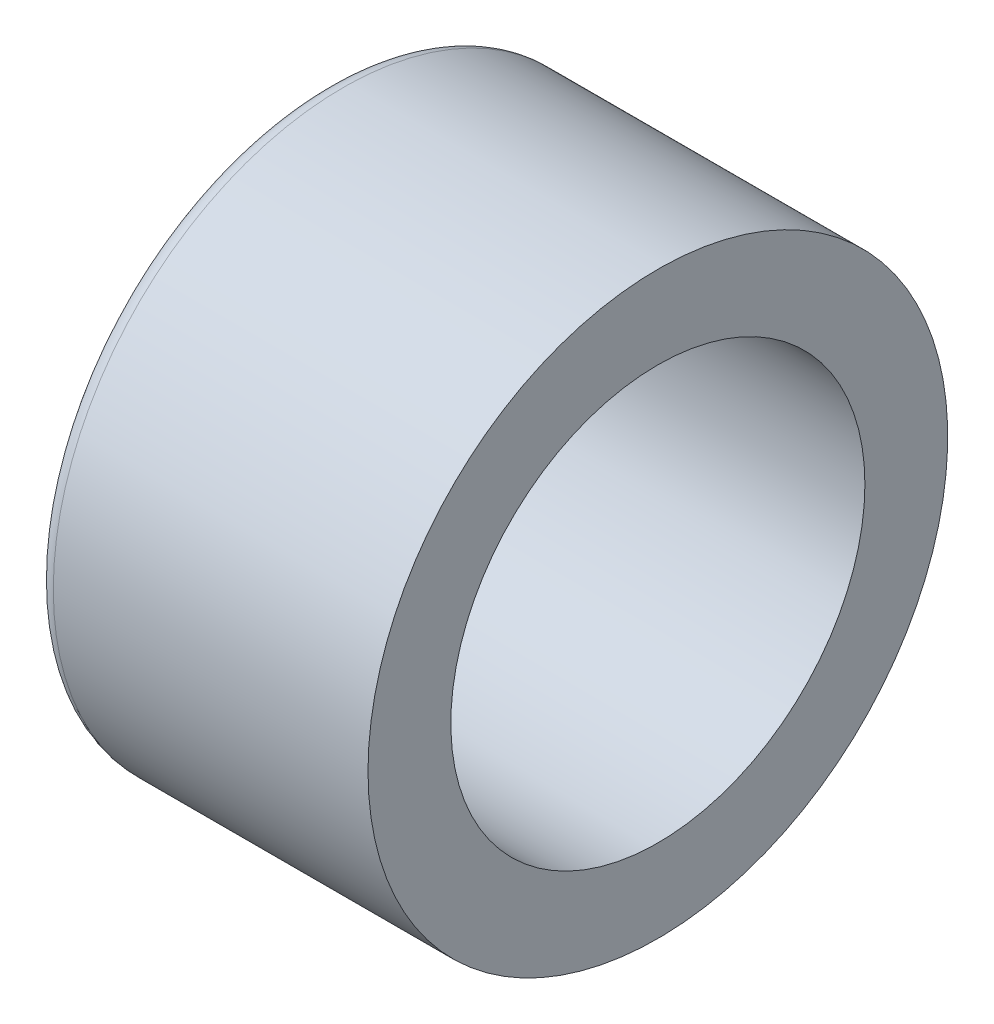
ISO-10303-21;
HEADER;
FILE_DESCRIPTION(('STEP AP214'),'2;1');
FILE_NAME('part.step','',(''),(''),'','','');
FILE_SCHEMA(('AUTOMOTIVE_DESIGN { 1 0 10303 214 1 1 1 1 }'));
ENDSEC;
DATA;
#1=APPLICATION_CONTEXT('core data for automotive mechanical design processes');
#2=APPLICATION_PROTOCOL_DEFINITION('international standard','automotive_design',2000,#1);
#3=PRODUCT_CONTEXT('',#1,'mechanical');
#4=PRODUCT('Part','Part','',(#3));
#5=PRODUCT_RELATED_PRODUCT_CATEGORY('part','',(#4));
#6=PRODUCT_DEFINITION_FORMATION('','',#4);
#7=PRODUCT_DEFINITION_CONTEXT('part definition',#1,'design');
#8=PRODUCT_DEFINITION('design','',#6,#7);
#9=PRODUCT_DEFINITION_SHAPE('','',#8);
#10=(LENGTH_UNIT() NAMED_UNIT(*) SI_UNIT(.MILLI.,.METRE.));
#11=(NAMED_UNIT(*) PLANE_ANGLE_UNIT() SI_UNIT($,.RADIAN.));
#12=(NAMED_UNIT(*) SI_UNIT($,.STERADIAN.) SOLID_ANGLE_UNIT());
#13=UNCERTAINTY_MEASURE_WITH_UNIT(LENGTH_MEASURE(1.E-05),#10,'distance_accuracy_value','');
#14=(GEOMETRIC_REPRESENTATION_CONTEXT(3) GLOBAL_UNCERTAINTY_ASSIGNED_CONTEXT((#13)) GLOBAL_UNIT_ASSIGNED_CONTEXT((#10,
#11,#12)) REPRESENTATION_CONTEXT('',''));
#15=CARTESIAN_POINT('',(0.,0.,0.));
#16=DIRECTION('',(0.,0.,1.));
#17=DIRECTION('',(1.,0.,0.));
#18=AXIS2_PLACEMENT_3D('',#15,#16,#17);
#19=CARTESIAN_POINT('',(0.,0.,0.));
#20=DIRECTION('',(-1.,0.,0.));
#21=DIRECTION('',(0.,0.,1.));
#22=AXIS2_PLACEMENT_3D('',#19,#20,#21);
#23=PLANE('',#22);
#24=CARTESIAN_POINT('',(0.,-5.17152448698351E-11,-2.23916996056062E-11));
#25=DIRECTION('',(1.,0.,0.));
#26=DIRECTION('',(0.,1.,0.));
#27=AXIS2_PLACEMENT_3D('',#24,#25,#26);
#28=CIRCLE('',#27,2.50000000005387);
#29=CARTESIAN_POINT('',(0.,2.50000000000215,-2.23916996056062E-11));
#30=VERTEX_POINT('',#29);
#31=EDGE_CURVE('E52',#30,#30,#28,.T.);
#32=ORIENTED_EDGE('',*,*,#31,.T.);
#33=EDGE_LOOP('',(#32));
#34=FACE_BOUND('',#33,.T.);
#35=CARTESIAN_POINT('',(0.,0.,0.));
#36=DIRECTION('',(-1.,0.,0.));
#37=DIRECTION('',(0.,0.,1.));
#38=AXIS2_PLACEMENT_3D('',#35,#36,#37);
#39=CIRCLE('',#38,3.3);
#40=CARTESIAN_POINT('',(0.,0.,3.3));
#41=VERTEX_POINT('',#40);
#42=EDGE_CURVE('E43',#41,#41,#39,.T.);
#43=ORIENTED_EDGE('',*,*,#42,.T.);
#44=EDGE_LOOP('',(#43));
#45=FACE_BOUND('',#44,.T.);
#46=ADVANCED_FACE('F35',(#34,#45),#23,.T.);
#47=CARTESIAN_POINT('',(-31.75,0.,0.));
#48=DIRECTION('',(-1.,0.,0.));
#49=DIRECTION('',(0.,0.,1.));
#50=AXIS2_PLACEMENT_3D('',#47,#48,#49);
#51=CYLINDRICAL_SURFACE('',#50,3.5);
#52=CARTESIAN_POINT('',(0.199999999999999,0.,0.));
#53=DIRECTION('',(-1.,0.,0.));
#54=DIRECTION('',(0.,0.,1.));
#55=AXIS2_PLACEMENT_3D('',#52,#53,#54);
#56=CIRCLE('',#55,3.5);
#57=CARTESIAN_POINT('',(0.199999999999999,0.,3.5));
#58=VERTEX_POINT('',#57);
#59=EDGE_CURVE('E10',#58,#58,#56,.F.);
#60=ORIENTED_EDGE('',*,*,#59,.T.);
#61=EDGE_LOOP('',(#60));
#62=FACE_BOUND('',#61,.T.);
#63=CARTESIAN_POINT('',(4.,0.,0.));
#64=DIRECTION('',(-1.,0.,0.));
#65=DIRECTION('',(0.,0.,1.));
#66=AXIS2_PLACEMENT_3D('',#63,#64,#65);
#67=CIRCLE('',#66,3.5);
#68=CARTESIAN_POINT('',(4.,0.,3.5));
#69=VERTEX_POINT('',#68);
#70=EDGE_CURVE('E47',#69,#69,#67,.T.);
#71=ORIENTED_EDGE('',*,*,#70,.T.);
#72=EDGE_LOOP('',(#71));
#73=FACE_BOUND('',#72,.T.);
#74=ADVANCED_FACE('F65',(#62,#73),#51,.T.);
#75=CARTESIAN_POINT('',(4.00000000000001,3.5,0.));
#76=DIRECTION('',(1.,0.,0.));
#77=DIRECTION('',(0.,0.,-1.));
#78=AXIS2_PLACEMENT_3D('',#75,#76,#77);
#79=PLANE('',#78);
#80=CARTESIAN_POINT('',(4.00000000000001,-5.17160150061077E-11,-2.23918106279086E-11));
#81=DIRECTION('',(1.,0.,0.));
#82=DIRECTION('',(0.,0.,-1.));
#83=AXIS2_PLACEMENT_3D('',#80,#81,#82);
#84=CIRCLE('',#83,2.50000000005387);
#85=CARTESIAN_POINT('',(4.00000000000001,-5.17160150061077E-11,-2.50000000007626));
#86=VERTEX_POINT('',#85);
#87=EDGE_CURVE('E39',#86,#86,#84,.T.);
#88=ORIENTED_EDGE('',*,*,#87,.F.);
#89=EDGE_LOOP('',(#88));
#90=FACE_BOUND('',#89,.T.);
#91=ORIENTED_EDGE('',*,*,#70,.F.);
#92=EDGE_LOOP('',(#91));
#93=FACE_BOUND('',#92,.T.);
#94=ADVANCED_FACE('F62',(#90,#93),#79,.T.);
#95=CARTESIAN_POINT('',(0.199999999999999,0.,0.));
#96=DIRECTION('',(-1.,0.,0.));
#97=DIRECTION('',(0.,0.,1.));
#98=AXIS2_PLACEMENT_3D('',#95,#96,#97);
#99=TOROIDAL_SURFACE('',#98,3.3,0.2);
#100=ORIENTED_EDGE('',*,*,#59,.F.);
#101=EDGE_LOOP('',(#100));
#102=FACE_BOUND('',#101,.T.);
#103=ORIENTED_EDGE('',*,*,#42,.F.);
#104=EDGE_LOOP('',(#103));
#105=FACE_BOUND('',#104,.T.);
#106=ADVANCED_FACE('F37',(#102,#105),#99,.T.);
#107=CARTESIAN_POINT('',(0.,-5.17152448698351E-11,-2.23916996056062E-11));
#108=DIRECTION('',(1.,0.,0.));
#109=DIRECTION('',(0.,1.,0.));
#110=AXIS2_PLACEMENT_3D('',#107,#108,#109);
#111=CYLINDRICAL_SURFACE('',#110,2.50000000005387);
#112=ORIENTED_EDGE('',*,*,#87,.T.);
#113=EDGE_LOOP('',(#112));
#114=FACE_BOUND('',#113,.T.);
#115=ORIENTED_EDGE('',*,*,#31,.F.);
#116=EDGE_LOOP('',(#115));
#117=FACE_BOUND('',#116,.T.);
#118=ADVANCED_FACE('F59',(#114,#117),#111,.F.);
#119=CLOSED_SHELL('',(#46,#74,#94,#106,#118));
#120=MANIFOLD_SOLID_BREP('B2',#119);
#121=ADVANCED_BREP_SHAPE_REPRESENTATION('',(#18,#120),#14);
#122=SHAPE_DEFINITION_REPRESENTATION(#9,#121);
ENDSEC;
END-ISO-10303-21;
